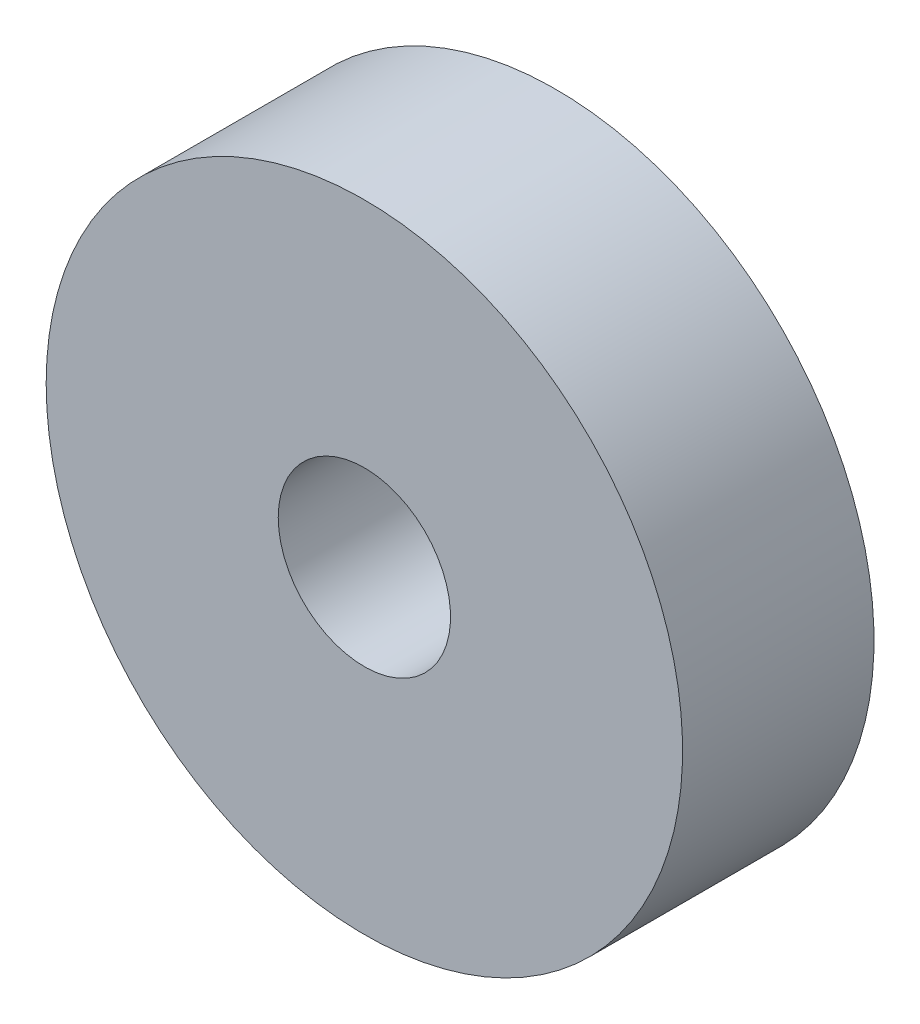
ISO-10303-21;
HEADER;
FILE_DESCRIPTION(('STEP AP214'),'2;1');
FILE_NAME('part.step','',(''),(''),'','','');
FILE_SCHEMA(('AUTOMOTIVE_DESIGN { 1 0 10303 214 1 1 1 1 }'));
ENDSEC;
DATA;
#1=APPLICATION_CONTEXT('core data for automotive mechanical design processes');
#2=APPLICATION_PROTOCOL_DEFINITION('international standard','automotive_design',2000,#1);
#3=PRODUCT_CONTEXT('',#1,'mechanical');
#4=PRODUCT('Part','Part','',(#3));
#5=PRODUCT_RELATED_PRODUCT_CATEGORY('part','',(#4));
#6=PRODUCT_DEFINITION_FORMATION('','',#4);
#7=PRODUCT_DEFINITION_CONTEXT('part definition',#1,'design');
#8=PRODUCT_DEFINITION('design','',#6,#7);
#9=PRODUCT_DEFINITION_SHAPE('','',#8);
#10=(LENGTH_UNIT() NAMED_UNIT(*) SI_UNIT(.MILLI.,.METRE.));
#11=(NAMED_UNIT(*) PLANE_ANGLE_UNIT() SI_UNIT($,.RADIAN.));
#12=(NAMED_UNIT(*) SI_UNIT($,.STERADIAN.) SOLID_ANGLE_UNIT());
#13=UNCERTAINTY_MEASURE_WITH_UNIT(LENGTH_MEASURE(1.E-05),#10,'distance_accuracy_value','');
#14=(GEOMETRIC_REPRESENTATION_CONTEXT(3) GLOBAL_UNCERTAINTY_ASSIGNED_CONTEXT((#13)) GLOBAL_UNIT_ASSIGNED_CONTEXT((#10,
#11,#12)) REPRESENTATION_CONTEXT('',''));
#15=CARTESIAN_POINT('',(0.,0.,0.));
#16=DIRECTION('',(0.,0.,1.));
#17=DIRECTION('',(1.,0.,0.));
#18=AXIS2_PLACEMENT_3D('',#15,#16,#17);
#19=CARTESIAN_POINT('',(-0.000237799056168608,-0.000237799056140853,3.39581309287756));
#20=DIRECTION('',(0.,0.,-1.));
#21=DIRECTION('',(-1.,0.,0.));
#22=AXIS2_PLACEMENT_3D('',#19,#20,#21);
#23=CYLINDRICAL_SURFACE('',#22,1.35023777811232);
#24=CARTESIAN_POINT('',(-0.000237799056168608,-0.000237799056140853,0.395813092877562));
#25=DIRECTION('',(0.,0.,-1.));
#26=DIRECTION('',(-1.,0.,0.));
#27=AXIS2_PLACEMENT_3D('',#24,#25,#26);
#28=CIRCLE('',#27,1.35023777811232);
#29=CARTESIAN_POINT('',(-1.35047557716849,-0.000237799056140853,0.395813092877562));
#30=VERTEX_POINT('',#29);
#31=EDGE_CURVE('E10',#30,#30,#28,.T.);
#32=ORIENTED_EDGE('',*,*,#31,.T.);
#33=EDGE_LOOP('',(#32));
#34=FACE_BOUND('',#33,.T.);
#35=CARTESIAN_POINT('',(-0.000237799056168608,-0.000237799056140853,3.39581309287756));
#36=DIRECTION('',(0.,0.,-1.));
#37=DIRECTION('',(-1.,0.,0.));
#38=AXIS2_PLACEMENT_3D('',#35,#36,#37);
#39=CIRCLE('',#38,1.35023777811232);
#40=CARTESIAN_POINT('',(-1.35047557716849,-0.000237799056140853,3.39581309287756));
#41=VERTEX_POINT('',#40);
#42=EDGE_CURVE('E49',#41,#41,#39,.T.);
#43=ORIENTED_EDGE('',*,*,#42,.F.);
#44=EDGE_LOOP('',(#43));
#45=FACE_BOUND('',#44,.T.);
#46=ADVANCED_FACE('F35',(#34,#45),#23,.F.);
#47=CARTESIAN_POINT('',(1.34999997905615,-0.000237799056140853,0.395813092877562));
#48=DIRECTION('',(0.,0.,-1.));
#49=DIRECTION('',(-1.,0.,0.));
#50=AXIS2_PLACEMENT_3D('',#47,#48,#49);
#51=PLANE('',#50);
#52=CARTESIAN_POINT('',(-0.000237799056168608,-0.000237799056140853,0.395813092877562));
#53=DIRECTION('',(0.,0.,-1.));
#54=DIRECTION('',(-1.,0.,0.));
#55=AXIS2_PLACEMENT_3D('',#52,#53,#54);
#56=CIRCLE('',#55,4.98716201229748);
#57=CARTESIAN_POINT('',(-4.98739981135365,-0.000237799056140853,0.395813092877562));
#58=VERTEX_POINT('',#57);
#59=EDGE_CURVE('E41',#58,#58,#56,.T.);
#60=ORIENTED_EDGE('',*,*,#59,.T.);
#61=EDGE_LOOP('',(#60));
#62=FACE_BOUND('',#61,.T.);
#63=ORIENTED_EDGE('',*,*,#31,.F.);
#64=EDGE_LOOP('',(#63));
#65=FACE_BOUND('',#64,.T.);
#66=ADVANCED_FACE('F59',(#62,#65),#51,.T.);
#67=CARTESIAN_POINT('',(-0.000237799056168608,-0.000237799056140853,3.39581309287756));
#68=DIRECTION('',(0.,0.,-1.));
#69=DIRECTION('',(-1.,0.,0.));
#70=AXIS2_PLACEMENT_3D('',#67,#68,#69);
#71=CYLINDRICAL_SURFACE('',#70,4.98716201229748);
#72=CARTESIAN_POINT('',(-0.000237799056168608,-0.000237799056140853,3.39581309287756));
#73=DIRECTION('',(0.,0.,-1.));
#74=DIRECTION('',(-1.,0.,0.));
#75=AXIS2_PLACEMENT_3D('',#72,#73,#74);
#76=CIRCLE('',#75,4.98716201229748);
#77=CARTESIAN_POINT('',(-4.98739981135365,-0.000237799056140853,3.39581309287756));
#78=VERTEX_POINT('',#77);
#79=EDGE_CURVE('E45',#78,#78,#76,.T.);
#80=ORIENTED_EDGE('',*,*,#79,.T.);
#81=EDGE_LOOP('',(#80));
#82=FACE_BOUND('',#81,.T.);
#83=ORIENTED_EDGE('',*,*,#59,.F.);
#84=EDGE_LOOP('',(#83));
#85=FACE_BOUND('',#84,.T.);
#86=ADVANCED_FACE('F63',(#82,#85),#71,.T.);
#87=CARTESIAN_POINT('',(4.98692421324131,-0.000237799056140853,3.39581309287756));
#88=DIRECTION('',(0.,0.,1.));
#89=DIRECTION('',(1.,0.,0.));
#90=AXIS2_PLACEMENT_3D('',#87,#88,#89);
#91=PLANE('',#90);
#92=ORIENTED_EDGE('',*,*,#42,.T.);
#93=EDGE_LOOP('',(#92));
#94=FACE_BOUND('',#93,.T.);
#95=ORIENTED_EDGE('',*,*,#79,.F.);
#96=EDGE_LOOP('',(#95));
#97=FACE_BOUND('',#96,.T.);
#98=ADVANCED_FACE('F55',(#94,#97),#91,.T.);
#99=CLOSED_SHELL('',(#46,#66,#86,#98));
#100=MANIFOLD_SOLID_BREP('B2',#99);
#101=ADVANCED_BREP_SHAPE_REPRESENTATION('',(#18,#100),#14);
#102=SHAPE_DEFINITION_REPRESENTATION(#9,#101);
ENDSEC;
END-ISO-10303-21;
